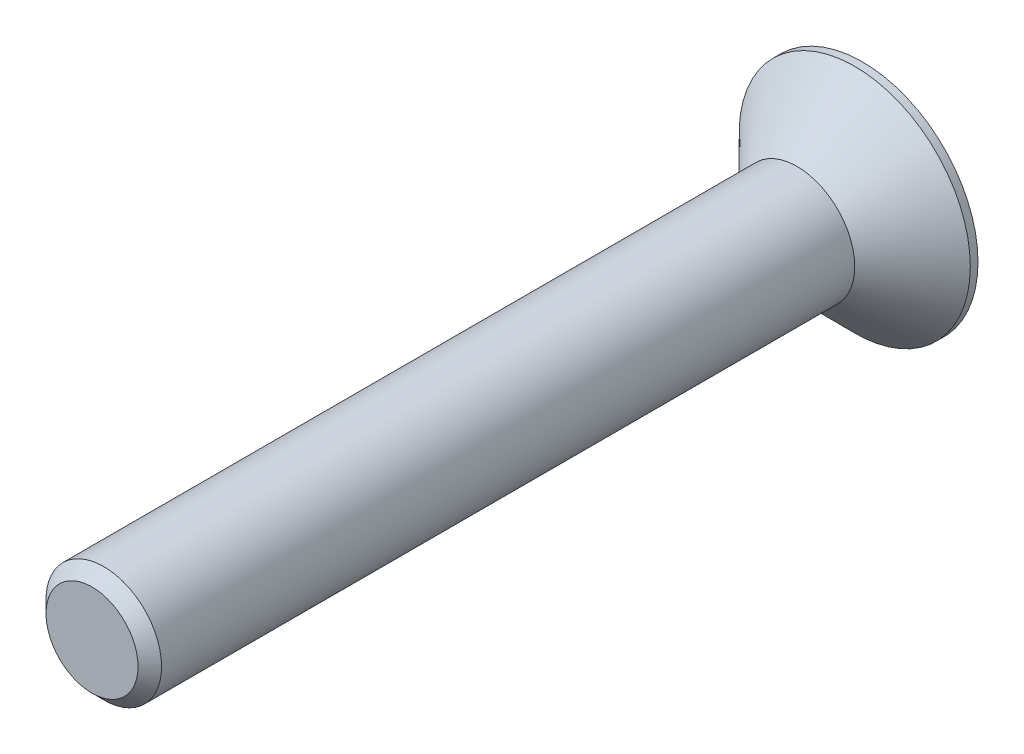
ISO-10303-21;
HEADER;
FILE_DESCRIPTION(('STEP AP214'),'2;1');
FILE_NAME('part.step','',(''),(''),'','','');
FILE_SCHEMA(('AUTOMOTIVE_DESIGN { 1 0 10303 214 1 1 1 1 }'));
ENDSEC;
DATA;
#1=APPLICATION_CONTEXT('core data for automotive mechanical design processes');
#2=APPLICATION_PROTOCOL_DEFINITION('international standard','automotive_design',2000,#1);
#3=PRODUCT_CONTEXT('',#1,'mechanical');
#4=PRODUCT('Part','Part','',(#3));
#5=PRODUCT_RELATED_PRODUCT_CATEGORY('part','',(#4));
#6=PRODUCT_DEFINITION_FORMATION('','',#4);
#7=PRODUCT_DEFINITION_CONTEXT('part definition',#1,'design');
#8=PRODUCT_DEFINITION('design','',#6,#7);
#9=PRODUCT_DEFINITION_SHAPE('','',#8);
#10=(LENGTH_UNIT() NAMED_UNIT(*) SI_UNIT(.MILLI.,.METRE.));
#11=(NAMED_UNIT(*) PLANE_ANGLE_UNIT() SI_UNIT($,.RADIAN.));
#12=(NAMED_UNIT(*) SI_UNIT($,.STERADIAN.) SOLID_ANGLE_UNIT());
#13=UNCERTAINTY_MEASURE_WITH_UNIT(LENGTH_MEASURE(1.E-05),#10,'distance_accuracy_value','');
#14=(GEOMETRIC_REPRESENTATION_CONTEXT(3) GLOBAL_UNCERTAINTY_ASSIGNED_CONTEXT((#13)) GLOBAL_UNIT_ASSIGNED_CONTEXT((#10,
#11,#12)) REPRESENTATION_CONTEXT('',''));
#15=CARTESIAN_POINT('',(0.,0.,0.));
#16=DIRECTION('',(0.,0.,1.));
#17=DIRECTION('',(1.,0.,0.));
#18=AXIS2_PLACEMENT_3D('',#15,#16,#17);
#19=CARTESIAN_POINT('',(0.,0.,-1.7));
#20=DIRECTION('',(0.,0.,1.));
#21=DIRECTION('',(1.,0.,0.));
#22=AXIS2_PLACEMENT_3D('',#19,#20,#21);
#23=CYLINDRICAL_SURFACE('',#22,3.);
#24=CARTESIAN_POINT('',(0.,0.,-1.7));
#25=DIRECTION('',(0.,0.,1.));
#26=DIRECTION('',(1.,0.,0.));
#27=AXIS2_PLACEMENT_3D('',#24,#25,#26);
#28=CIRCLE('',#27,3.);
#29=CARTESIAN_POINT('',(3.,0.,-1.7));
#30=VERTEX_POINT('',#29);
#31=EDGE_CURVE('E129',#30,#30,#28,.T.);
#32=ORIENTED_EDGE('',*,*,#31,.T.);
#33=EDGE_LOOP('',(#32));
#34=FACE_BOUND('',#33,.T.);
#35=CARTESIAN_POINT('',(0.,0.,-1.5));
#36=DIRECTION('',(0.,0.,1.));
#37=DIRECTION('',(1.,0.,0.));
#38=AXIS2_PLACEMENT_3D('',#35,#36,#37);
#39=CIRCLE('',#38,3.);
#40=CARTESIAN_POINT('',(3.,0.,-1.5));
#41=VERTEX_POINT('',#40);
#42=EDGE_CURVE('E118',#41,#41,#39,.T.);
#43=ORIENTED_EDGE('',*,*,#42,.F.);
#44=EDGE_LOOP('',(#43));
#45=FACE_BOUND('',#44,.T.);
#46=ADVANCED_FACE('F16',(#34,#45),#23,.T.);
#47=CARTESIAN_POINT('',(3.,0.,-1.7));
#48=DIRECTION('',(0.,0.,-1.));
#49=DIRECTION('',(-1.,0.,0.));
#50=AXIS2_PLACEMENT_3D('',#47,#48,#49);
#51=PLANE('',#50);
#52=DIRECTION('',(1.,0.,0.));
#53=VECTOR('',#52,1.);
#54=CARTESIAN_POINT('',(-0.577350269189618,1.,-1.7));
#55=LINE('',#54,#53);
#56=CARTESIAN_POINT('',(-0.577350269189618,1.,-1.7));
#57=VERTEX_POINT('',#56);
#58=CARTESIAN_POINT('',(0.577350269189617,1.,-1.7));
#59=VERTEX_POINT('',#58);
#60=EDGE_CURVE('E31',#57,#59,#55,.T.);
#61=ORIENTED_EDGE('',*,*,#60,.F.);
#62=DIRECTION('',(0.5,0.866025403784439,0.));
#63=VECTOR('',#62,1.);
#64=CARTESIAN_POINT('',(-1.15470053837925,0.,-1.7));
#65=LINE('',#64,#63);
#66=CARTESIAN_POINT('',(-1.15470053837925,0.,-1.7));
#67=VERTEX_POINT('',#66);
#68=EDGE_CURVE('E114',#67,#57,#65,.T.);
#69=ORIENTED_EDGE('',*,*,#68,.F.);
#70=DIRECTION('',(-0.5,0.866025403784438,0.));
#71=VECTOR('',#70,1.);
#72=CARTESIAN_POINT('',(-0.577350269189634,-1.,-1.7));
#73=LINE('',#72,#71);
#74=CARTESIAN_POINT('',(-0.577350269189634,-1.,-1.7));
#75=VERTEX_POINT('',#74);
#76=EDGE_CURVE('E112',#75,#67,#73,.T.);
#77=ORIENTED_EDGE('',*,*,#76,.F.);
#78=DIRECTION('',(-1.,0.,0.));
#79=VECTOR('',#78,1.);
#80=CARTESIAN_POINT('',(0.577350269189633,-1.,-1.7));
#81=LINE('',#80,#79);
#82=CARTESIAN_POINT('',(0.577350269189633,-1.,-1.7));
#83=VERTEX_POINT('',#82);
#84=EDGE_CURVE('E79',#83,#75,#81,.T.);
#85=ORIENTED_EDGE('',*,*,#84,.F.);
#86=DIRECTION('',(-0.5,-0.866025403784439,0.));
#87=VECTOR('',#86,1.);
#88=CARTESIAN_POINT('',(1.15470053837925,0.,-1.7));
#89=LINE('',#88,#87);
#90=CARTESIAN_POINT('',(1.15470053837925,0.,-1.7));
#91=VERTEX_POINT('',#90);
#92=EDGE_CURVE('E108',#91,#83,#89,.T.);
#93=ORIENTED_EDGE('',*,*,#92,.F.);
#94=DIRECTION('',(0.5,-0.866025403784438,0.));
#95=VECTOR('',#94,1.);
#96=CARTESIAN_POINT('',(0.577350269189617,1.,-1.7));
#97=LINE('',#96,#95);
#98=EDGE_CURVE('E105',#59,#91,#97,.T.);
#99=ORIENTED_EDGE('',*,*,#98,.F.);
#100=EDGE_LOOP('',(#61,#69,#77,#85,#93,#99));
#101=FACE_BOUND('',#100,.T.);
#102=ORIENTED_EDGE('',*,*,#31,.F.);
#103=EDGE_LOOP('',(#102));
#104=FACE_BOUND('',#103,.T.);
#105=ADVANCED_FACE('F147',(#101,#104),#51,.T.);
#106=CARTESIAN_POINT('',(0.,0.,18.3));
#107=DIRECTION('',(0.,0.,1.));
#108=DIRECTION('',(1.,0.,0.));
#109=AXIS2_PLACEMENT_3D('',#106,#107,#108);
#110=PLANE('',#109);
#111=CARTESIAN_POINT('',(0.,0.,18.3));
#112=DIRECTION('',(0.,0.,1.));
#113=DIRECTION('',(1.,0.,0.));
#114=AXIS2_PLACEMENT_3D('',#111,#112,#113);
#115=CIRCLE('',#114,1.195);
#116=CARTESIAN_POINT('',(1.195,0.,18.3));
#117=VERTEX_POINT('',#116);
#118=EDGE_CURVE('E24',#117,#117,#115,.T.);
#119=ORIENTED_EDGE('',*,*,#118,.T.);
#120=EDGE_LOOP('',(#119));
#121=FACE_BOUND('',#120,.T.);
#122=ADVANCED_FACE('F134',(#121),#110,.T.);
#123=CARTESIAN_POINT('',(0.,0.,-1.7));
#124=DIRECTION('',(0.,0.,1.));
#125=DIRECTION('',(1.,0.,0.));
#126=AXIS2_PLACEMENT_3D('',#123,#124,#125);
#127=CYLINDRICAL_SURFACE('',#126,1.5);
#128=CARTESIAN_POINT('',(0.,0.,17.995));
#129=DIRECTION('',(0.,0.,1.));
#130=DIRECTION('',(1.,0.,0.));
#131=AXIS2_PLACEMENT_3D('',#128,#129,#130);
#132=CIRCLE('',#131,1.5);
#133=CARTESIAN_POINT('',(1.5,0.,17.995));
#134=VERTEX_POINT('',#133);
#135=EDGE_CURVE('E10',#134,#134,#132,.F.);
#136=ORIENTED_EDGE('',*,*,#135,.T.);
#137=EDGE_LOOP('',(#136));
#138=FACE_BOUND('',#137,.T.);
#139=CARTESIAN_POINT('',(0.,0.,0.));
#140=DIRECTION('',(0.,0.,1.));
#141=DIRECTION('',(1.,0.,0.));
#142=AXIS2_PLACEMENT_3D('',#139,#140,#141);
#143=CIRCLE('',#142,1.5);
#144=CARTESIAN_POINT('',(1.5,0.,0.));
#145=VERTEX_POINT('',#144);
#146=EDGE_CURVE('E126',#145,#145,#143,.T.);
#147=ORIENTED_EDGE('',*,*,#146,.T.);
#148=EDGE_LOOP('',(#147));
#149=FACE_BOUND('',#148,.T.);
#150=ADVANCED_FACE('F159',(#138,#149),#127,.T.);
#151=CARTESIAN_POINT('',(0.,0.,0.));
#152=DIRECTION('',(0.,0.,-1.));
#153=DIRECTION('',(-1.,0.,0.));
#154=AXIS2_PLACEMENT_3D('',#151,#152,#153);
#155=CONICAL_SURFACE('',#154,1.5,0.785398163397448);
#156=ORIENTED_EDGE('',*,*,#42,.T.);
#157=EDGE_LOOP('',(#156));
#158=FACE_BOUND('',#157,.T.);
#159=ORIENTED_EDGE('',*,*,#146,.F.);
#160=EDGE_LOOP('',(#159));
#161=FACE_BOUND('',#160,.T.);
#162=ADVANCED_FACE('F162',(#158,#161),#155,.T.);
#163=CARTESIAN_POINT('',(-0.577350269189618,1.,-0.5));
#164=DIRECTION('',(0.,1.,0.));
#165=DIRECTION('',(0.,0.,1.));
#166=AXIS2_PLACEMENT_3D('',#163,#164,#165);
#167=PLANE('',#166);
#168=ORIENTED_EDGE('',*,*,#60,.T.);
#169=DIRECTION('',(0.,0.,-1.));
#170=VECTOR('',#169,1.);
#171=CARTESIAN_POINT('',(0.577350269189617,1.,-0.5));
#172=LINE('',#171,#170);
#173=CARTESIAN_POINT('',(0.577350269189617,1.,-0.5));
#174=VERTEX_POINT('',#173);
#175=EDGE_CURVE('E61',#174,#59,#172,.T.);
#176=ORIENTED_EDGE('',*,*,#175,.F.);
#177=DIRECTION('',(1.,0.,0.));
#178=VECTOR('',#177,1.);
#179=CARTESIAN_POINT('',(-0.577350269189618,1.,-0.5));
#180=LINE('',#179,#178);
#181=CARTESIAN_POINT('',(-0.577350269189618,1.,-0.5));
#182=VERTEX_POINT('',#181);
#183=EDGE_CURVE('E116',#182,#174,#180,.T.);
#184=ORIENTED_EDGE('',*,*,#183,.F.);
#185=DIRECTION('',(0.,0.,-1.));
#186=VECTOR('',#185,1.);
#187=CARTESIAN_POINT('',(-0.577350269189618,1.,-0.5));
#188=LINE('',#187,#186);
#189=EDGE_CURVE('E39',#182,#57,#188,.T.);
#190=ORIENTED_EDGE('',*,*,#189,.T.);
#191=EDGE_LOOP('',(#168,#176,#184,#190));
#192=FACE_BOUND('',#191,.T.);
#193=ADVANCED_FACE('F166',(#192),#167,.F.);
#194=CARTESIAN_POINT('',(-1.15470053837925,0.,-0.5));
#195=DIRECTION('',(-0.866025403784439,0.5,0.));
#196=DIRECTION('',(-0.5,-0.866025403784439,0.));
#197=AXIS2_PLACEMENT_3D('',#194,#195,#196);
#198=PLANE('',#197);
#199=ORIENTED_EDGE('',*,*,#68,.T.);
#200=ORIENTED_EDGE('',*,*,#189,.F.);
#201=DIRECTION('',(0.5,0.866025403784439,0.));
#202=VECTOR('',#201,1.);
#203=CARTESIAN_POINT('',(-1.15470053837925,0.,-0.5));
#204=LINE('',#203,#202);
#205=CARTESIAN_POINT('',(-1.15470053837925,0.,-0.5));
#206=VERTEX_POINT('',#205);
#207=EDGE_CURVE('E91',#206,#182,#204,.T.);
#208=ORIENTED_EDGE('',*,*,#207,.F.);
#209=DIRECTION('',(0.,0.,-1.));
#210=VECTOR('',#209,1.);
#211=CARTESIAN_POINT('',(-1.15470053837925,0.,-0.5));
#212=LINE('',#211,#210);
#213=EDGE_CURVE('E83',#206,#67,#212,.T.);
#214=ORIENTED_EDGE('',*,*,#213,.T.);
#215=EDGE_LOOP('',(#199,#200,#208,#214));
#216=FACE_BOUND('',#215,.T.);
#217=ADVANCED_FACE('F170',(#216),#198,.F.);
#218=CARTESIAN_POINT('',(-0.577350269189634,-1.,-0.5));
#219=DIRECTION('',(-0.866025403784438,-0.5,0.));
#220=DIRECTION('',(0.5,-0.866025403784438,0.));
#221=AXIS2_PLACEMENT_3D('',#218,#219,#220);
#222=PLANE('',#221);
#223=ORIENTED_EDGE('',*,*,#76,.T.);
#224=ORIENTED_EDGE('',*,*,#213,.F.);
#225=DIRECTION('',(-0.5,0.866025403784438,0.));
#226=VECTOR('',#225,1.);
#227=CARTESIAN_POINT('',(-0.577350269189634,-1.,-0.5));
#228=LINE('',#227,#226);
#229=CARTESIAN_POINT('',(-0.577350269189634,-1.,-0.5));
#230=VERTEX_POINT('',#229);
#231=EDGE_CURVE('E87',#230,#206,#228,.T.);
#232=ORIENTED_EDGE('',*,*,#231,.F.);
#233=DIRECTION('',(0.,0.,-1.));
#234=VECTOR('',#233,1.);
#235=CARTESIAN_POINT('',(-0.577350269189634,-1.,-0.5));
#236=LINE('',#235,#234);
#237=EDGE_CURVE('E72',#230,#75,#236,.T.);
#238=ORIENTED_EDGE('',*,*,#237,.T.);
#239=EDGE_LOOP('',(#223,#224,#232,#238));
#240=FACE_BOUND('',#239,.T.);
#241=ADVANCED_FACE('F88',(#240),#222,.F.);
#242=CARTESIAN_POINT('',(0.577350269189633,-1.,-0.5));
#243=DIRECTION('',(0.,-1.,0.));
#244=DIRECTION('',(0.,0.,-1.));
#245=AXIS2_PLACEMENT_3D('',#242,#243,#244);
#246=PLANE('',#245);
#247=ORIENTED_EDGE('',*,*,#84,.T.);
#248=ORIENTED_EDGE('',*,*,#237,.F.);
#249=DIRECTION('',(-1.,0.,0.));
#250=VECTOR('',#249,1.);
#251=CARTESIAN_POINT('',(0.577350269189633,-1.,-0.5));
#252=LINE('',#251,#250);
#253=CARTESIAN_POINT('',(0.577350269189633,-1.,-0.5));
#254=VERTEX_POINT('',#253);
#255=EDGE_CURVE('E76',#254,#230,#252,.T.);
#256=ORIENTED_EDGE('',*,*,#255,.F.);
#257=DIRECTION('',(0.,0.,-1.));
#258=VECTOR('',#257,1.);
#259=CARTESIAN_POINT('',(0.577350269189633,-1.,-0.5));
#260=LINE('',#259,#258);
#261=EDGE_CURVE('E84',#254,#83,#260,.T.);
#262=ORIENTED_EDGE('',*,*,#261,.T.);
#263=EDGE_LOOP('',(#247,#248,#256,#262));
#264=FACE_BOUND('',#263,.T.);
#265=ADVANCED_FACE('F74',(#264),#246,.F.);
#266=CARTESIAN_POINT('',(1.15470053837925,0.,-0.5));
#267=DIRECTION('',(0.866025403784439,-0.5,0.));
#268=DIRECTION('',(0.5,0.866025403784439,0.));
#269=AXIS2_PLACEMENT_3D('',#266,#267,#268);
#270=PLANE('',#269);
#271=ORIENTED_EDGE('',*,*,#92,.T.);
#272=ORIENTED_EDGE('',*,*,#261,.F.);
#273=DIRECTION('',(-0.5,-0.866025403784439,0.));
#274=VECTOR('',#273,1.);
#275=CARTESIAN_POINT('',(1.15470053837925,0.,-0.5));
#276=LINE('',#275,#274);
#277=CARTESIAN_POINT('',(1.15470053837925,0.,-0.5));
#278=VERTEX_POINT('',#277);
#279=EDGE_CURVE('E97',#278,#254,#276,.T.);
#280=ORIENTED_EDGE('',*,*,#279,.F.);
#281=DIRECTION('',(0.,0.,-1.));
#282=VECTOR('',#281,1.);
#283=CARTESIAN_POINT('',(1.15470053837925,0.,-0.5));
#284=LINE('',#283,#282);
#285=EDGE_CURVE('E121',#278,#91,#284,.T.);
#286=ORIENTED_EDGE('',*,*,#285,.T.);
#287=EDGE_LOOP('',(#271,#272,#280,#286));
#288=FACE_BOUND('',#287,.T.);
#289=ADVANCED_FACE('F173',(#288),#270,.F.);
#290=CARTESIAN_POINT('',(0.577350269189617,1.,-0.5));
#291=DIRECTION('',(0.866025403784438,0.5,0.));
#292=DIRECTION('',(-0.5,0.866025403784438,0.));
#293=AXIS2_PLACEMENT_3D('',#290,#291,#292);
#294=PLANE('',#293);
#295=ORIENTED_EDGE('',*,*,#98,.T.);
#296=ORIENTED_EDGE('',*,*,#285,.F.);
#297=DIRECTION('',(0.5,-0.866025403784438,0.));
#298=VECTOR('',#297,1.);
#299=CARTESIAN_POINT('',(0.577350269189617,1.,-0.5));
#300=LINE('',#299,#298);
#301=EDGE_CURVE('E99',#174,#278,#300,.T.);
#302=ORIENTED_EDGE('',*,*,#301,.F.);
#303=ORIENTED_EDGE('',*,*,#175,.T.);
#304=EDGE_LOOP('',(#295,#296,#302,#303));
#305=FACE_BOUND('',#304,.T.);
#306=ADVANCED_FACE('F143',(#305),#294,.F.);
#307=CARTESIAN_POINT('',(0.577350269189617,1.,-0.5));
#308=DIRECTION('',(0.,0.,-1.));
#309=DIRECTION('',(-1.,0.,0.));
#310=AXIS2_PLACEMENT_3D('',#307,#308,#309);
#311=PLANE('',#310);
#312=ORIENTED_EDGE('',*,*,#183,.T.);
#313=ORIENTED_EDGE('',*,*,#301,.T.);
#314=ORIENTED_EDGE('',*,*,#279,.T.);
#315=ORIENTED_EDGE('',*,*,#255,.T.);
#316=ORIENTED_EDGE('',*,*,#231,.T.);
#317=ORIENTED_EDGE('',*,*,#207,.T.);
#318=EDGE_LOOP('',(#312,#313,#314,#315,#316,#317));
#319=FACE_BOUND('',#318,.T.);
#320=ADVANCED_FACE('F94',(#319),#311,.T.);
#321=CARTESIAN_POINT('',(0.,0.,18.3));
#322=DIRECTION('',(0.,0.,-1.));
#323=DIRECTION('',(-1.,0.,0.));
#324=AXIS2_PLACEMENT_3D('',#321,#322,#323);
#325=CONICAL_SURFACE('',#324,1.195,0.785398163397449);
#326=ORIENTED_EDGE('',*,*,#135,.F.);
#327=EDGE_LOOP('',(#326));
#328=FACE_BOUND('',#327,.T.);
#329=ORIENTED_EDGE('',*,*,#118,.F.);
#330=EDGE_LOOP('',(#329));
#331=FACE_BOUND('',#330,.T.);
#332=ADVANCED_FACE('F18',(#328,#331),#325,.T.);
#333=CLOSED_SHELL('',(#46,#105,#122,#150,#162,#193,#217,#241,#265,#289,#306,#320,#332));
#334=MANIFOLD_SOLID_BREP('B1',#333);
#335=ADVANCED_BREP_SHAPE_REPRESENTATION('',(#18,#334),#14);
#336=SHAPE_DEFINITION_REPRESENTATION(#9,#335);
ENDSEC;
END-ISO-10303-21;
